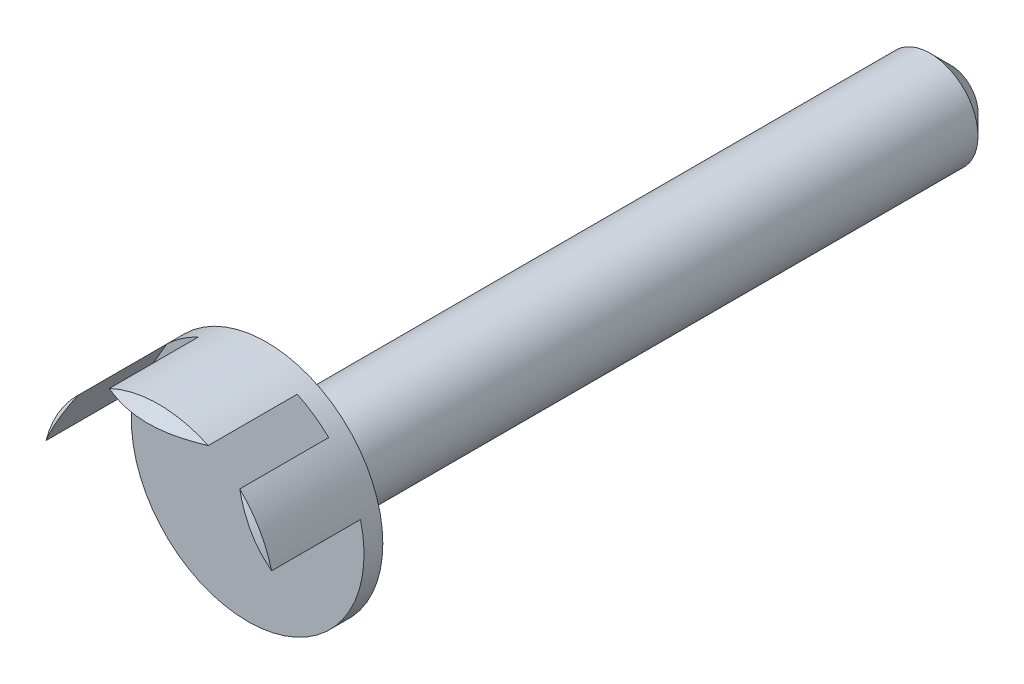
ISO-10303-21;
HEADER;
FILE_DESCRIPTION(('STEP AP214'),'2;1');
FILE_NAME('part.step','',(''),(''),'','','');
FILE_SCHEMA(('AUTOMOTIVE_DESIGN { 1 0 10303 214 1 1 1 1 }'));
ENDSEC;
DATA;
#1=APPLICATION_CONTEXT('core data for automotive mechanical design processes');
#2=APPLICATION_PROTOCOL_DEFINITION('international standard','automotive_design',2000,#1);
#3=PRODUCT_CONTEXT('',#1,'mechanical');
#4=PRODUCT('Part','Part','',(#3));
#5=PRODUCT_RELATED_PRODUCT_CATEGORY('part','',(#4));
#6=PRODUCT_DEFINITION_FORMATION('','',#4);
#7=PRODUCT_DEFINITION_CONTEXT('part definition',#1,'design');
#8=PRODUCT_DEFINITION('design','',#6,#7);
#9=PRODUCT_DEFINITION_SHAPE('','',#8);
#10=(LENGTH_UNIT() NAMED_UNIT(*) SI_UNIT(.MILLI.,.METRE.));
#11=(NAMED_UNIT(*) PLANE_ANGLE_UNIT() SI_UNIT($,.RADIAN.));
#12=(NAMED_UNIT(*) SI_UNIT($,.STERADIAN.) SOLID_ANGLE_UNIT());
#13=UNCERTAINTY_MEASURE_WITH_UNIT(LENGTH_MEASURE(1.E-05),#10,'distance_accuracy_value','');
#14=(GEOMETRIC_REPRESENTATION_CONTEXT(3) GLOBAL_UNCERTAINTY_ASSIGNED_CONTEXT((#13)) GLOBAL_UNIT_ASSIGNED_CONTEXT((#10,
#11,#12)) REPRESENTATION_CONTEXT('',''));
#15=CARTESIAN_POINT('',(0.,0.,0.));
#16=DIRECTION('',(0.,0.,1.));
#17=DIRECTION('',(1.,0.,0.));
#18=AXIS2_PLACEMENT_3D('',#15,#16,#17);
#19=CARTESIAN_POINT('',(0.,0.491553117569765,30.1625));
#20=DIRECTION('',(0.,0.,-1.));
#21=DIRECTION('',(-1.,0.,0.));
#22=AXIS2_PLACEMENT_3D('',#19,#20,#21);
#23=CONICAL_SURFACE('',#22,3.556,0.785398163397445);
#24=CARTESIAN_POINT('',(-3.0067724886651,3.59093538528162,29.4003));
#25=CARTESIAN_POINT('',(-3.05875596948841,3.50089735534137,29.428761315697));
#26=CARTESIAN_POINT('',(-3.11121223385922,3.41004044027586,29.4539442732479));
#27=CARTESIAN_POINT('',(-3.21690391273826,3.22697708252012,29.4970810087418));
#28=CARTESIAN_POINT('',(-3.27013992890106,3.1347695977336,29.515028862557));
#29=CARTESIAN_POINT('',(-3.37606112656595,2.95130870177945,29.5426926258668));
#30=CARTESIAN_POINT('',(-3.42873579504057,2.86007349970956,29.5525671092125));
#31=CARTESIAN_POINT('',(-3.53428687648542,2.67725366385325,29.5642999003916));
#32=CARTESIAN_POINT('',(-3.58716318543472,2.58566921023635,29.5661618958959));
#33=CARTESIAN_POINT('',(-3.68582842766235,2.41477599775701,29.5620941429121));
#34=CARTESIAN_POINT('',(-3.73162846425056,2.33544800739771,29.5571637568697));
#35=CARTESIAN_POINT('',(-3.82298368661133,2.1772161207321,29.5413745343583));
#36=CARTESIAN_POINT('',(-3.86853880534083,2.09831234054777,29.5305141505237));
#37=CARTESIAN_POINT('',(-3.96002985690437,1.93984519080181,29.5029256887664));
#38=CARTESIAN_POINT('',(-4.00595805776445,1.86029521341194,29.4860962685712));
#39=CARTESIAN_POINT('',(-4.09721659212403,1.70223079527686,29.4470901272334));
#40=CARTESIAN_POINT('',(-4.14254726610537,1.62371576479984,29.4249166036788));
#41=CARTESIAN_POINT('',(-4.18753002421003,1.545803342298,29.4003));
#42=B_SPLINE_CURVE_WITH_KNOTS('',3,(#24,#25,#26,#27,#28,#29,#30,#31,#32,#33,#34,#35,#36,#37,#38,
#39,#40,#41),.UNSPECIFIED.,.F.,.F.,(4,2,2,2,2,2,2,2,4),(0.,0.323393694592942,0.647051649818208,
0.96418844012591,1.28117925563588,1.55618416222829,1.83126086254404,2.11125090946686,
2.3910738413968),.UNSPECIFIED.);
#43=CARTESIAN_POINT('',(-3.00713830790464,3.59030176777236,29.4005));
#44=VERTEX_POINT('',#43);
#45=CARTESIAN_POINT('',(-4.18716420497051,1.54643695980723,29.4005));
#46=VERTEX_POINT('',#45);
#47=EDGE_CURVE('E60',#44,#46,#42,.T.);
#48=ORIENTED_EDGE('',*,*,#47,.F.);
#49=CARTESIAN_POINT('',(0.,0.491553117569765,29.4005));
#50=DIRECTION('',(0.,0.,1.));
#51=DIRECTION('',(1.,0.,0.));
#52=AXIS2_PLACEMENT_3D('',#49,#50,#51);
#53=CIRCLE('',#52,4.318);
#54=EDGE_CURVE('E135',#46,#44,#53,.F.);
#55=ORIENTED_EDGE('',*,*,#54,.F.);
#56=EDGE_LOOP('',(#48,#55));
#57=FACE_BOUND('',#56,.T.);
#58=ADVANCED_FACE('F35',(#57),#23,.T.);
#59=CARTESIAN_POINT('',(-5.54823904098864,4.39940905122495,26.932168557007));
#60=CARTESIAN_POINT('',(-5.40853738962356,4.39940905122495,27.0463540436324));
#61=CARTESIAN_POINT('',(-5.26815592675546,4.39940905122495,27.1597210071783));
#62=CARTESIAN_POINT('',(-4.98568973326589,4.39940905122495,27.384385495487));
#63=CARTESIAN_POINT('',(-4.8436045756092,4.39940905122495,27.4956824827846));
#64=CARTESIAN_POINT('',(-4.55589226168209,4.39940905122495,27.71692010038));
#65=CARTESIAN_POINT('',(-4.41024335784673,4.39940905122495,27.8268325421876));
#66=CARTESIAN_POINT('',(-4.11652589575599,4.39940905122495,28.0433551962402));
#67=CARTESIAN_POINT('',(-3.96845757055912,4.39940905122495,28.1499657237214));
#68=CARTESIAN_POINT('',(-3.65572020940231,4.39940905122495,28.368548117122));
#69=CARTESIAN_POINT('',(-3.49077019010559,4.39940905122495,28.4801202470709));
#70=CARTESIAN_POINT('',(-3.15649860589611,4.39940905122495,28.6966880185415));
#71=CARTESIAN_POINT('',(-2.98717566431429,4.39940905122495,28.8016815524745));
#72=CARTESIAN_POINT('',(-2.64404025050046,4.39940905122495,29.0022532864694));
#73=CARTESIAN_POINT('',(-2.47025205579266,4.39940905122495,29.0978726352014));
#74=CARTESIAN_POINT('',(-2.11655070661356,4.39940905122495,29.2768919045517));
#75=CARTESIAN_POINT('',(-1.9366429328971,4.39940905122495,29.3603022345485));
#76=CARTESIAN_POINT('',(-1.6216611026267,4.39940905122495,29.4892287455562));
#77=CARTESIAN_POINT('',(-1.48825763738596,4.39940905122495,29.5387968681267));
#78=CARTESIAN_POINT('',(-1.21787659050887,4.39940905122495,29.6272591437075));
#79=CARTESIAN_POINT('',(-1.08089852051049,4.39940905122495,29.6661518297923));
#80=CARTESIAN_POINT('',(-0.806921326535902,4.39940905122495,29.730375174071));
#81=CARTESIAN_POINT('',(-0.669988767073366,4.39940905122495,29.7559849883316));
#82=CARTESIAN_POINT('',(-0.394219643398777,4.39940905122495,29.7931831473457));
#83=CARTESIAN_POINT('',(-0.255383527859319,4.39940905122495,29.8047747406629));
#84=CARTESIAN_POINT('',(0.0157204418032506,4.39940905122495,29.8128428070964));
#85=CARTESIAN_POINT('',(0.147966538688736,4.39940905122495,29.8100518849497));
#86=CARTESIAN_POINT('',(0.411505782611327,4.39940905122495,29.7912374727692));
#87=CARTESIAN_POINT('',(0.542798859659799,4.39940905122495,29.7752130206033));
#88=CARTESIAN_POINT('',(0.805771650370493,4.39940905122495,29.7305835581179));
#89=CARTESIAN_POINT('',(0.937410871972672,4.39940905122495,29.7017441572761));
#90=CARTESIAN_POINT('',(1.19775761957779,4.39940905122495,29.6331390532199));
#91=CARTESIAN_POINT('',(1.32646521905202,4.39940905122495,29.5933736241569));
#92=CARTESIAN_POINT('',(1.58461474377138,4.39940905122495,29.5033791270471));
#93=CARTESIAN_POINT('',(1.71395560492587,4.39940905122495,29.4528637460887));
#94=CARTESIAN_POINT('',(1.96931107768708,4.39940905122495,29.3440086250778));
#95=CARTESIAN_POINT('',(2.09532464024862,4.39940905122495,29.2856664517969));
#96=CARTESIAN_POINT('',(2.34463301890625,4.39940905122495,29.1625307422162));
#97=CARTESIAN_POINT('',(2.46791789683952,4.39940905122495,29.097717249047));
#98=CARTESIAN_POINT('',(2.71166931131927,4.39940905122495,28.9630641294292));
#99=CARTESIAN_POINT('',(2.83213626890175,4.39940905122495,28.8932252602794));
#100=CARTESIAN_POINT('',(3.06471950083696,4.39940905122495,28.7530527307573));
#101=CARTESIAN_POINT('',(3.17695410833941,4.39940905122495,28.6829143772391));
#102=CARTESIAN_POINT('',(3.39949482277602,4.39940905122495,28.5396334820313));
#103=CARTESIAN_POINT('',(3.50980078562265,4.39940905122495,28.4664907172402));
#104=CARTESIAN_POINT('',(3.72785564974753,4.39940905122495,28.3183253540752));
#105=CARTESIAN_POINT('',(3.83561791632261,4.39940905122495,28.2433223545657));
#106=CARTESIAN_POINT('',(4.0496614229168,4.39940905122495,28.0912913159734));
#107=CARTESIAN_POINT('',(4.15594306288728,4.39940905122495,28.0142638406384));
#108=CARTESIAN_POINT('',(4.26160297247968,4.39940905122495,27.9364071355389));
#109=B_SPLINE_CURVE_WITH_KNOTS('',3,(#59,#60,#61,#62,#63,#64,#65,#66,#67,#68,#69,#70,#71,#72,
#73,#74,#75,#76,#77,#78,#79,#80,#81,#82,#83,#84,#85,#86,#87,#88,#89,#90,#91,#92,#93,#94,#95,#96,
#97,#98,#99,#100,#101,#102,#103,#104,#105,#106,#107,#108),.UNSPECIFIED.,.F.,.F.,(4,2,2,2,2,2,2,
2,2,2,2,2,2,2,2,2,2,2,2,2,2,2,2,2,4),(0.,0.54129838338422,1.08273540509071,1.63009996242558,
2.17741210037178,2.77471532034249,3.37220893044566,3.96694984103295,4.56118068588912,
4.98776801541686,5.41441393355429,5.8316874821595,6.24886431381047,6.64500803931193,
7.0411805686275,7.44491826344284,7.84864582876752,8.26489675723471,8.68127739285485,
9.0989842771122,9.51662834633647,9.91361640326136,10.3106339932022,10.7044911996845,
11.098239868657),.UNSPECIFIED.);
#110=CARTESIAN_POINT('',(1.83678686890884,4.39940905122495,29.4005));
#111=VERTEX_POINT('',#110);
#112=CARTESIAN_POINT('',(-1.83678686890884,4.39940905122495,29.4005));
#113=VERTEX_POINT('',#112);
#114=EDGE_CURVE('E145',#111,#113,#109,.F.);
#115=ORIENTED_EDGE('',*,*,#114,.F.);
#116=EDGE_CURVE('E139',#113,#111,#53,.F.);
#117=ORIENTED_EDGE('',*,*,#116,.F.);
#118=EDGE_LOOP('',(#115,#117));
#119=FACE_BOUND('',#118,.T.);
#120=ADVANCED_FACE('F169',(#119),#23,.T.);
#121=CARTESIAN_POINT('',(0.,0.,25.4));
#122=DIRECTION('',(0.,0.,-1.));
#123=DIRECTION('',(-1.,0.,0.));
#124=AXIS2_PLACEMENT_3D('',#121,#122,#123);
#125=CYLINDRICAL_SURFACE('',#124,1.778);
#126=CARTESIAN_POINT('',(0.,0.,0.762000000000002));
#127=DIRECTION('',(0.,0.,1.));
#128=DIRECTION('',(1.,0.,0.));
#129=AXIS2_PLACEMENT_3D('',#126,#127,#128);
#130=CIRCLE('',#129,1.778);
#131=CARTESIAN_POINT('',(1.778,0.,0.762000000000002));
#132=VERTEX_POINT('',#131);
#133=EDGE_CURVE('E129',#132,#132,#130,.T.);
#134=ORIENTED_EDGE('',*,*,#133,.T.);
#135=EDGE_LOOP('',(#134));
#136=FACE_BOUND('',#135,.T.);
#137=CARTESIAN_POINT('',(0.,0.,25.4));
#138=DIRECTION('',(0.,0.,1.));
#139=DIRECTION('',(1.,0.,0.));
#140=AXIS2_PLACEMENT_3D('',#137,#138,#139);
#141=CIRCLE('',#140,1.778);
#142=CARTESIAN_POINT('',(1.778,0.,25.4));
#143=VERTEX_POINT('',#142);
#144=EDGE_CURVE('E126',#143,#143,#141,.T.);
#145=ORIENTED_EDGE('',*,*,#144,.F.);
#146=EDGE_LOOP('',(#145));
#147=FACE_BOUND('',#146,.T.);
#148=ADVANCED_FACE('F166',(#136,#147),#125,.T.);
#149=CARTESIAN_POINT('',(0.,0.,0.));
#150=DIRECTION('',(0.,0.,1.));
#151=DIRECTION('',(1.,0.,0.));
#152=AXIS2_PLACEMENT_3D('',#149,#150,#151);
#153=PLANE('',#152);
#154=CARTESIAN_POINT('',(0.,0.,0.));
#155=DIRECTION('',(0.,0.,1.));
#156=DIRECTION('',(1.,0.,0.));
#157=AXIS2_PLACEMENT_3D('',#154,#155,#156);
#158=CIRCLE('',#157,1.016);
#159=CARTESIAN_POINT('',(1.016,0.,0.));
#160=VERTEX_POINT('',#159);
#161=EDGE_CURVE('E132',#160,#160,#158,.F.);
#162=ORIENTED_EDGE('',*,*,#161,.T.);
#163=EDGE_LOOP('',(#162));
#164=FACE_BOUND('',#163,.T.);
#165=ADVANCED_FACE('F159',(#164),#153,.F.);
#166=CARTESIAN_POINT('',(0.,0.491553117569765,25.4));
#167=DIRECTION('',(0.,0.,1.));
#168=DIRECTION('',(1.,0.,0.));
#169=AXIS2_PLACEMENT_3D('',#166,#167,#168);
#170=PLANE('',#169);
#171=CARTESIAN_POINT('',(0.,0.491553117569765,25.4));
#172=DIRECTION('',(0.,0.,1.));
#173=DIRECTION('',(1.,0.,0.));
#174=AXIS2_PLACEMENT_3D('',#171,#172,#173);
#175=CIRCLE('',#174,4.318);
#176=CARTESIAN_POINT('',(4.318,0.491553117569765,25.4));
#177=VERTEX_POINT('',#176);
#178=EDGE_CURVE('E123',#177,#177,#175,.T.);
#179=ORIENTED_EDGE('',*,*,#178,.F.);
#180=EDGE_LOOP('',(#179));
#181=FACE_BOUND('',#180,.T.);
#182=ORIENTED_EDGE('',*,*,#144,.T.);
#183=EDGE_LOOP('',(#182));
#184=FACE_BOUND('',#183,.T.);
#185=ADVANCED_FACE('F156',(#181,#184),#170,.F.);
#186=CARTESIAN_POINT('',(0.,0.491553117569765,30.1625));
#187=DIRECTION('',(0.,0.,-1.));
#188=DIRECTION('',(-1.,0.,0.));
#189=AXIS2_PLACEMENT_3D('',#186,#187,#188);
#190=CYLINDRICAL_SURFACE('',#189,4.318);
#191=ORIENTED_EDGE('',*,*,#116,.T.);
#192=DIRECTION('',(0.,0.,-1.));
#193=VECTOR('',#192,1.);
#194=CARTESIAN_POINT('',(1.83678686890884,4.39940905122495,30.1625));
#195=LINE('',#194,#193);
#196=CARTESIAN_POINT('',(1.83678686890884,4.39940905122495,26.0985));
#197=VERTEX_POINT('',#196);
#198=EDGE_CURVE('E111',#111,#197,#195,.T.);
#199=ORIENTED_EDGE('',*,*,#198,.T.);
#200=CARTESIAN_POINT('',(0.,0.491553117569765,26.0985));
#201=DIRECTION('',(0.,0.,1.));
#202=DIRECTION('',(1.,0.,0.));
#203=AXIS2_PLACEMENT_3D('',#200,#201,#202);
#204=CIRCLE('',#203,4.318);
#205=CARTESIAN_POINT('',(3.00713830790464,3.59030176777236,26.0985));
#206=VERTEX_POINT('',#205);
#207=EDGE_CURVE('E11',#206,#197,#204,.T.);
#208=ORIENTED_EDGE('',*,*,#207,.F.);
#209=DIRECTION('',(0.,0.,-1.));
#210=VECTOR('',#209,1.);
#211=CARTESIAN_POINT('',(3.00713830790464,3.59030176777237,30.1625));
#212=LINE('',#211,#210);
#213=CARTESIAN_POINT('',(3.00713830790464,3.59030176777236,29.4005));
#214=VERTEX_POINT('',#213);
#215=EDGE_CURVE('E99',#206,#214,#212,.F.);
#216=ORIENTED_EDGE('',*,*,#215,.T.);
#217=CARTESIAN_POINT('',(4.18716420497051,1.54643695980724,29.4005));
#218=VERTEX_POINT('',#217);
#219=EDGE_CURVE('E107',#214,#218,#53,.F.);
#220=ORIENTED_EDGE('',*,*,#219,.T.);
#221=DIRECTION('',(0.,0.,-1.));
#222=VECTOR('',#221,1.);
#223=CARTESIAN_POINT('',(4.18716420497051,1.54643695980723,30.1625));
#224=LINE('',#223,#222);
#225=CARTESIAN_POINT('',(4.18716420497051,1.54643695980724,26.0985));
#226=VERTEX_POINT('',#225);
#227=EDGE_CURVE('E52',#218,#226,#224,.T.);
#228=ORIENTED_EDGE('',*,*,#227,.T.);
#229=CARTESIAN_POINT('',(-4.18716420497051,1.54643695980723,26.0985));
#230=VERTEX_POINT('',#229);
#231=EDGE_CURVE('E40',#230,#226,#204,.T.);
#232=ORIENTED_EDGE('',*,*,#231,.F.);
#233=DIRECTION('',(0.,0.,-1.));
#234=VECTOR('',#233,1.);
#235=CARTESIAN_POINT('',(-4.18716420497051,1.54643695980723,30.1625));
#236=LINE('',#235,#234);
#237=EDGE_CURVE('E118',#230,#46,#236,.F.);
#238=ORIENTED_EDGE('',*,*,#237,.T.);
#239=ORIENTED_EDGE('',*,*,#54,.T.);
#240=DIRECTION('',(0.,0.,-1.));
#241=VECTOR('',#240,1.);
#242=CARTESIAN_POINT('',(-3.00713830790464,3.59030176777236,30.1625));
#243=LINE('',#242,#241);
#244=CARTESIAN_POINT('',(-3.00713830790464,3.59030176777236,26.0985));
#245=VERTEX_POINT('',#244);
#246=EDGE_CURVE('E120',#44,#245,#243,.T.);
#247=ORIENTED_EDGE('',*,*,#246,.T.);
#248=CARTESIAN_POINT('',(-1.83678686890884,4.39940905122495,26.0985));
#249=VERTEX_POINT('',#248);
#250=EDGE_CURVE('E45',#249,#245,#204,.T.);
#251=ORIENTED_EDGE('',*,*,#250,.F.);
#252=DIRECTION('',(0.,0.,-1.));
#253=VECTOR('',#252,1.);
#254=CARTESIAN_POINT('',(-1.83678686890884,4.39940905122495,30.1625));
#255=LINE('',#254,#253);
#256=EDGE_CURVE('E108',#249,#113,#255,.F.);
#257=ORIENTED_EDGE('',*,*,#256,.T.);
#258=EDGE_LOOP('',(#191,#199,#208,#216,#220,#228,#232,#238,#239,#247,#251,#257));
#259=FACE_BOUND('',#258,.T.);
#260=ORIENTED_EDGE('',*,*,#178,.T.);
#261=EDGE_LOOP('',(#260));
#262=FACE_BOUND('',#261,.T.);
#263=ADVANCED_FACE('F104',(#259,#262),#190,.T.);
#264=CARTESIAN_POINT('',(0.,0.,0.762000000000002));
#265=DIRECTION('',(0.,0.,1.));
#266=DIRECTION('',(1.,0.,0.));
#267=AXIS2_PLACEMENT_3D('',#264,#265,#266);
#268=CONICAL_SURFACE('',#267,1.778,0.78539816339745);
#269=ORIENTED_EDGE('',*,*,#161,.F.);
#270=EDGE_LOOP('',(#269));
#271=FACE_BOUND('',#270,.T.);
#272=ORIENTED_EDGE('',*,*,#133,.F.);
#273=EDGE_LOOP('',(#272));
#274=FACE_BOUND('',#273,.T.);
#275=ADVANCED_FACE('F163',(#271,#274),#268,.T.);
#276=CARTESIAN_POINT('',(4.18753002421003,1.545803342298,29.4003));
#277=CARTESIAN_POINT('',(4.13554654338672,1.63584137223825,29.428761315697));
#278=CARTESIAN_POINT('',(4.08309027901591,1.72669828730376,29.4539442732479));
#279=CARTESIAN_POINT('',(3.97739860013688,1.90976164505951,29.4970810087418));
#280=CARTESIAN_POINT('',(3.92416258397408,2.00196912984602,29.515028862557));
#281=CARTESIAN_POINT('',(3.81824138630918,2.18543002580018,29.5426926258668));
#282=CARTESIAN_POINT('',(3.76556671783456,2.27666522787007,29.5525671092125));
#283=CARTESIAN_POINT('',(3.66001563638972,2.45948506372637,29.5642999003916));
#284=CARTESIAN_POINT('',(3.60713932744041,2.55106951734328,29.5661618958959));
#285=CARTESIAN_POINT('',(3.50847408521279,2.72196272982262,29.5620941429121));
#286=CARTESIAN_POINT('',(3.46267404862458,2.80129072018191,29.5571637568697));
#287=CARTESIAN_POINT('',(3.37131882626381,2.95952260684752,29.5413745343583));
#288=CARTESIAN_POINT('',(3.3257637075343,3.03842638703185,29.5305141505237));
#289=CARTESIAN_POINT('',(3.23427265597076,3.19689353677781,29.5029256887664));
#290=CARTESIAN_POINT('',(3.18834445511069,3.27644351416768,29.4860962685712));
#291=CARTESIAN_POINT('',(3.0970859207511,3.43450793230276,29.4470901272334));
#292=CARTESIAN_POINT('',(3.05175524676976,3.51302296277978,29.4249166036788));
#293=CARTESIAN_POINT('',(3.00677248866511,3.59093538528162,29.4003));
#294=B_SPLINE_CURVE_WITH_KNOTS('',3,(#276,#277,#278,#279,#280,#281,#282,#283,#284,#285,#286,
#287,#288,#289,#290,#291,#292,#293),.UNSPECIFIED.,.F.,.F.,(4,2,2,2,2,2,2,2,4),(0.,
0.323393694592943,0.647051649818207,0.964188440125909,1.28117925563588,1.55618416222829,
1.83126086254404,2.11125090946686,2.3910738413968),.UNSPECIFIED.);
#295=EDGE_CURVE('E138',#218,#214,#294,.T.);
#296=ORIENTED_EDGE('',*,*,#295,.F.);
#297=ORIENTED_EDGE('',*,*,#219,.F.);
#298=EDGE_LOOP('',(#296,#297));
#299=FACE_BOUND('',#298,.T.);
#300=ADVANCED_FACE('F37',(#299),#23,.T.);
#301=CARTESIAN_POINT('',(7.62,4.39940905122495,26.0985));
#302=DIRECTION('',(0.,0.,1.));
#303=DIRECTION('',(1.,0.,0.));
#304=AXIS2_PLACEMENT_3D('',#301,#302,#303);
#305=PLANE('',#304);
#306=ORIENTED_EDGE('',*,*,#207,.T.);
#307=DIRECTION('',(-1.,0.,0.));
#308=VECTOR('',#307,1.);
#309=CARTESIAN_POINT('',(2.54,4.39940905122495,26.0985));
#310=LINE('',#309,#308);
#311=EDGE_CURVE('E100',#197,#249,#310,.T.);
#312=ORIENTED_EDGE('',*,*,#311,.T.);
#313=ORIENTED_EDGE('',*,*,#250,.T.);
#314=DIRECTION('',(-0.5,-0.866025403784439,0.));
#315=VECTOR('',#314,1.);
#316=CARTESIAN_POINT('',(-2.54,4.39940905122495,26.0985));
#317=LINE('',#316,#315);
#318=EDGE_CURVE('E95',#245,#230,#317,.T.);
#319=ORIENTED_EDGE('',*,*,#318,.T.);
#320=ORIENTED_EDGE('',*,*,#231,.T.);
#321=DIRECTION('',(-0.5,0.866025403784438,0.));
#322=VECTOR('',#321,1.);
#323=CARTESIAN_POINT('',(5.08,0.,26.0985));
#324=LINE('',#323,#322);
#325=EDGE_CURVE('E92',#226,#206,#324,.T.);
#326=ORIENTED_EDGE('',*,*,#325,.T.);
#327=EDGE_LOOP('',(#306,#312,#313,#319,#320,#326));
#328=FACE_BOUND('',#327,.T.);
#329=ADVANCED_FACE('F91',(#328),#305,.T.);
#330=CARTESIAN_POINT('',(-2.54,4.39940905122495,26.0985));
#331=DIRECTION('',(-0.866025403784439,0.5,0.));
#332=DIRECTION('',(-0.5,-0.866025403784439,0.));
#333=AXIS2_PLACEMENT_3D('',#330,#331,#332);
#334=PLANE('',#333);
#335=ORIENTED_EDGE('',*,*,#47,.T.);
#336=ORIENTED_EDGE('',*,*,#237,.F.);
#337=ORIENTED_EDGE('',*,*,#318,.F.);
#338=ORIENTED_EDGE('',*,*,#246,.F.);
#339=EDGE_LOOP('',(#335,#336,#337,#338));
#340=FACE_BOUND('',#339,.T.);
#341=ADVANCED_FACE('F187',(#340),#334,.F.);
#342=CARTESIAN_POINT('',(2.54,4.39940905122495,26.0985));
#343=DIRECTION('',(0.,1.,0.));
#344=DIRECTION('',(0.,0.,1.));
#345=AXIS2_PLACEMENT_3D('',#342,#343,#344);
#346=PLANE('',#345);
#347=ORIENTED_EDGE('',*,*,#114,.T.);
#348=ORIENTED_EDGE('',*,*,#256,.F.);
#349=ORIENTED_EDGE('',*,*,#311,.F.);
#350=ORIENTED_EDGE('',*,*,#198,.F.);
#351=EDGE_LOOP('',(#347,#348,#349,#350));
#352=FACE_BOUND('',#351,.T.);
#353=ADVANCED_FACE('F153',(#352),#346,.F.);
#354=CARTESIAN_POINT('',(5.08,0.,26.0985));
#355=DIRECTION('',(0.866025403784438,0.5,0.));
#356=DIRECTION('',(-0.5,0.866025403784439,0.));
#357=AXIS2_PLACEMENT_3D('',#354,#355,#356);
#358=PLANE('',#357);
#359=ORIENTED_EDGE('',*,*,#295,.T.);
#360=ORIENTED_EDGE('',*,*,#215,.F.);
#361=ORIENTED_EDGE('',*,*,#325,.F.);
#362=ORIENTED_EDGE('',*,*,#227,.F.);
#363=EDGE_LOOP('',(#359,#360,#361,#362));
#364=FACE_BOUND('',#363,.T.);
#365=ADVANCED_FACE('F97',(#364),#358,.F.);
#366=CLOSED_SHELL('',(#58,#120,#148,#165,#185,#263,#275,#300,#329,#341,#353,#365));
#367=MANIFOLD_SOLID_BREP('B2',#366);
#368=ADVANCED_BREP_SHAPE_REPRESENTATION('',(#18,#367),#14);
#369=SHAPE_DEFINITION_REPRESENTATION(#9,#368);
ENDSEC;
END-ISO-10303-21;
